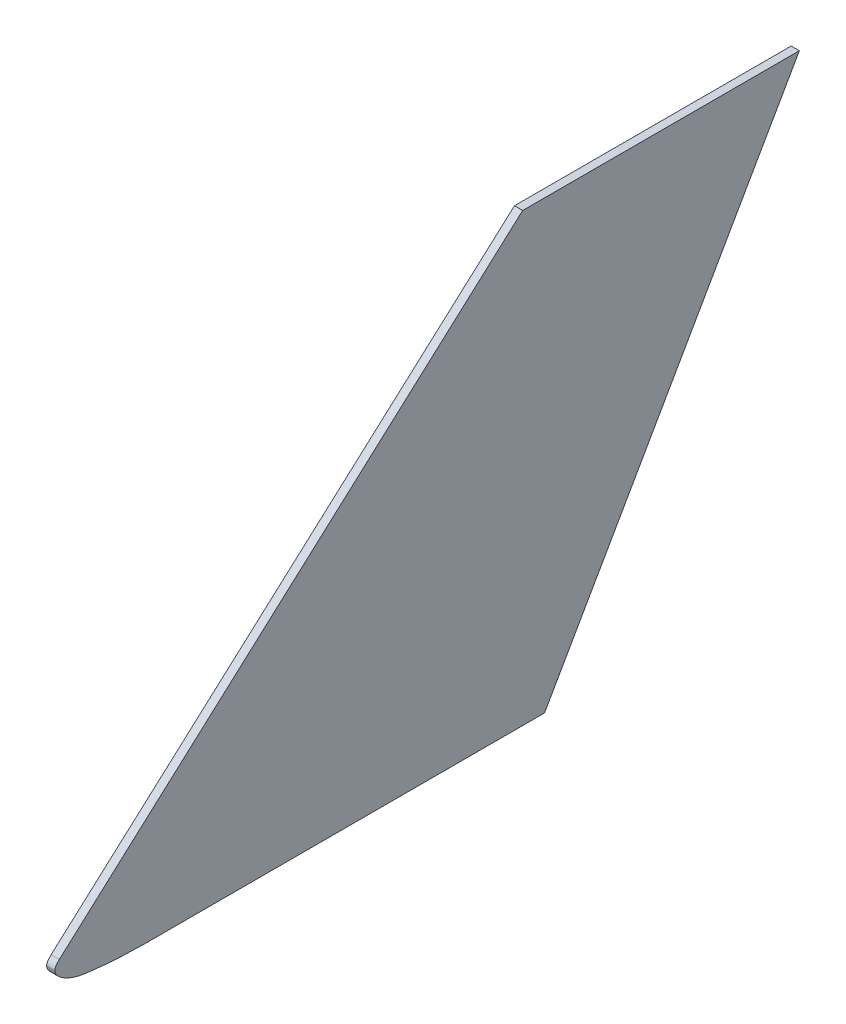
ISO-10303-21;
HEADER;
FILE_DESCRIPTION(('STEP AP214'),'2;1');
FILE_NAME('part.step','',(''),(''),'','','');
FILE_SCHEMA(('AUTOMOTIVE_DESIGN { 1 0 10303 214 1 1 1 1 }'));
ENDSEC;
DATA;
#1=APPLICATION_CONTEXT('core data for automotive mechanical design processes');
#2=APPLICATION_PROTOCOL_DEFINITION('international standard','automotive_design',2000,#1);
#3=PRODUCT_CONTEXT('',#1,'mechanical');
#4=PRODUCT('Part','Part','',(#3));
#5=PRODUCT_RELATED_PRODUCT_CATEGORY('part','',(#4));
#6=PRODUCT_DEFINITION_FORMATION('','',#4);
#7=PRODUCT_DEFINITION_CONTEXT('part definition',#1,'design');
#8=PRODUCT_DEFINITION('design','',#6,#7);
#9=PRODUCT_DEFINITION_SHAPE('','',#8);
#10=(LENGTH_UNIT() NAMED_UNIT(*) SI_UNIT(.MILLI.,.METRE.));
#11=(NAMED_UNIT(*) PLANE_ANGLE_UNIT() SI_UNIT($,.RADIAN.));
#12=(NAMED_UNIT(*) SI_UNIT($,.STERADIAN.) SOLID_ANGLE_UNIT());
#13=UNCERTAINTY_MEASURE_WITH_UNIT(LENGTH_MEASURE(1.E-05),#10,'distance_accuracy_value','');
#14=(GEOMETRIC_REPRESENTATION_CONTEXT(3) GLOBAL_UNCERTAINTY_ASSIGNED_CONTEXT((#13)) GLOBAL_UNIT_ASSIGNED_CONTEXT((#10,
#11,#12)) REPRESENTATION_CONTEXT('',''));
#15=CARTESIAN_POINT('',(0.,0.,0.));
#16=DIRECTION('',(0.,0.,1.));
#17=DIRECTION('',(1.,0.,0.));
#18=AXIS2_PLACEMENT_3D('',#15,#16,#17);
#19=CARTESIAN_POINT('',(2.667,145.,-161.163));
#20=DIRECTION('',(0.,-0.743401248874517,-0.668845709541303));
#21=DIRECTION('',(0.,0.668845709541303,-0.743401248874517));
#22=AXIS2_PLACEMENT_3D('',#19,#20,#21);
#23=PLANE('',#22);
#24=DIRECTION('',(-1.,0.,0.));
#25=VECTOR('',#24,1.);
#26=CARTESIAN_POINT('',(2.667,9.48281509372688,-10.5398546824159));
#27=LINE('',#26,#25);
#28=CARTESIAN_POINT('',(2.667,9.48281509372688,-10.5398546824159));
#29=VERTEX_POINT('',#28);
#30=CARTESIAN_POINT('',(0.,9.48281509372688,-10.5398546824159));
#31=VERTEX_POINT('',#30);
#32=EDGE_CURVE('E217',#29,#31,#27,.T.);
#33=ORIENTED_EDGE('',*,*,#32,.F.);
#34=DIRECTION('',(0.,-0.668845709541303,0.743401248874517));
#35=VECTOR('',#34,1.);
#36=CARTESIAN_POINT('',(2.667,145.,-161.163));
#37=LINE('',#36,#35);
#38=CARTESIAN_POINT('',(2.667,145.,-161.163));
#39=VERTEX_POINT('',#38);
#40=EDGE_CURVE('E116',#39,#29,#37,.T.);
#41=ORIENTED_EDGE('',*,*,#40,.F.);
#42=DIRECTION('',(-1.,0.,0.));
#43=VECTOR('',#42,1.);
#44=CARTESIAN_POINT('',(2.667,145.,-161.163));
#45=LINE('',#44,#43);
#46=CARTESIAN_POINT('',(0.,145.,-161.163));
#47=VERTEX_POINT('',#46);
#48=EDGE_CURVE('E111',#39,#47,#45,.T.);
#49=ORIENTED_EDGE('',*,*,#48,.T.);
#50=DIRECTION('',(0.,-0.668845709541303,0.743401248874517));
#51=VECTOR('',#50,1.);
#52=CARTESIAN_POINT('',(0.,145.,-161.163));
#53=LINE('',#52,#51);
#54=EDGE_CURVE('E121',#47,#31,#53,.T.);
#55=ORIENTED_EDGE('',*,*,#54,.T.);
#56=EDGE_LOOP('',(#33,#41,#49,#55));
#57=FACE_BOUND('',#56,.T.);
#58=ADVANCED_FACE('F33',(#57),#23,.F.);
#59=CARTESIAN_POINT('',(2.667,0.,0.));
#60=DIRECTION('',(0.,1.,0.));
#61=DIRECTION('',(0.,0.,1.));
#62=AXIS2_PLACEMENT_3D('',#59,#60,#61);
#63=PLANE('',#62);
#64=DIRECTION('',(-1.,0.,0.));
#65=VECTOR('',#64,1.);
#66=CARTESIAN_POINT('',(2.667,0.,-168.275));
#67=LINE('',#66,#65);
#68=CARTESIAN_POINT('',(2.667,0.,-168.275));
#69=VERTEX_POINT('',#68);
#70=CARTESIAN_POINT('',(0.,0.,-168.275));
#71=VERTEX_POINT('',#70);
#72=EDGE_CURVE('E42',#69,#71,#67,.T.);
#73=ORIENTED_EDGE('',*,*,#72,.F.);
#74=DIRECTION('',(0.,0.,-1.));
#75=VECTOR('',#74,1.);
#76=CARTESIAN_POINT('',(2.667,0.,0.));
#77=LINE('',#76,#75);
#78=CARTESIAN_POINT('',(2.667,-5.67515399336362E-12,-38.129253700367));
#79=VERTEX_POINT('',#78);
#80=EDGE_CURVE('E36',#79,#69,#77,.T.);
#81=ORIENTED_EDGE('',*,*,#80,.F.);
#82=DIRECTION('',(-1.,0.,0.));
#83=VECTOR('',#82,1.);
#84=CARTESIAN_POINT('',(2.667,-7.49834222490975E-12,-38.129253700367));
#85=LINE('',#84,#83);
#86=CARTESIAN_POINT('',(0.,-5.62376281038781E-12,-38.129253700367));
#87=VERTEX_POINT('',#86);
#88=EDGE_CURVE('E129',#87,#79,#85,.F.);
#89=ORIENTED_EDGE('',*,*,#88,.F.);
#90=DIRECTION('',(0.,0.,1.));
#91=VECTOR('',#90,1.);
#92=CARTESIAN_POINT('',(0.,0.,0.));
#93=LINE('',#92,#91);
#94=EDGE_CURVE('E128',#87,#71,#93,.F.);
#95=ORIENTED_EDGE('',*,*,#94,.T.);
#96=EDGE_LOOP('',(#73,#81,#89,#95));
#97=FACE_BOUND('',#96,.T.);
#98=ADVANCED_FACE('F277',(#97),#63,.F.);
#99=CARTESIAN_POINT('',(2.667,0.,0.));
#100=DIRECTION('',(1.,0.,0.));
#101=DIRECTION('',(0.,0.,-1.));
#102=AXIS2_PLACEMENT_3D('',#99,#100,#101);
#103=PLANE('',#102);
#104=ORIENTED_EDGE('',*,*,#40,.T.);
#105=DIRECTION('',(0.,0.,1.));
#106=VECTOR('',#105,1.);
#107=CARTESIAN_POINT('',(2.667,9.48281509372688,0.));
#108=LINE('',#107,#106);
#109=CARTESIAN_POINT('',(2.667,9.48281509372688,-10.6130492290752));
#110=VERTEX_POINT('',#109);
#111=EDGE_CURVE('E195',#110,#29,#108,.T.);
#112=ORIENTED_EDGE('',*,*,#111,.F.);
#113=CARTESIAN_POINT('',(2.667,6.96510530096529,-9.09609695231968));
#114=CARTESIAN_POINT('',(2.667,7.84201754075925,-9.05665947310691));
#115=CARTESIAN_POINT('',(2.667,8.68661145624891,-9.64995762065609));
#116=CARTESIAN_POINT('',(2.667,9.48281509372916,-10.6130492290779));
#117=B_SPLINE_CURVE_WITH_KNOTS('',3,(#113,#114,#115,#116),.UNSPECIFIED.,.F.,.F.,(4,4),
(0.0950031138030394,0.122643685896777),.UNSPECIFIED.);
#118=CARTESIAN_POINT('',(2.667,6.96510530097299,-9.09609695231932));
#119=VERTEX_POINT('',#118);
#120=EDGE_CURVE('E72',#119,#110,#117,.T.);
#121=ORIENTED_EDGE('',*,*,#120,.F.);
#122=CARTESIAN_POINT('',(2.667,1.10405974239114,-20.4791712343144));
#123=CARTESIAN_POINT('',(2.667,1.19086641299034,-19.7842066902313));
#124=CARTESIAN_POINT('',(2.667,1.69205912625934,-14.2943716879902));
#125=CARTESIAN_POINT('',(2.667,4.9600684892659,-9.18626971304355));
#126=CARTESIAN_POINT('',(2.667,6.96510530097299,-9.09609695231932));
#127=B_SPLINE_CURVE_WITH_KNOTS('',3,(#122,#123,#124,#125,#126),.UNSPECIFIED.,.F.,.F.,(4,1,4),
(0.,0.0318036714524566,0.0950031138030394),.UNSPECIFIED.);
#128=CARTESIAN_POINT('',(2.667,1.10405972617,-20.4791713656709));
#129=VERTEX_POINT('',#128);
#130=EDGE_CURVE('E177',#129,#119,#127,.T.);
#131=ORIENTED_EDGE('',*,*,#130,.F.);
#132=CARTESIAN_POINT('',(2.667,996154.645784788,-89261.3704599262));
#133=CARTESIAN_POINT('',(2.667,-997377.637337138,72339.9458838703));
#134=CARTESIAN_POINT('',(2.667,998602.130208448,-55529.9756850236));
#135=B_SPLINE_CURVE_WITH_KNOTS('',2,(#132,#133,#134),.UNSPECIFIED.,.F.,.F.,(3,3),(0.,1.),.UNSPECIFIED.);
#136=EDGE_CURVE('E197',#79,#129,#135,.T.);
#137=ORIENTED_EDGE('',*,*,#136,.F.);
#138=ORIENTED_EDGE('',*,*,#80,.T.);
#139=DIRECTION('',(0.,0.868380207092181,-0.495898997710765));
#140=VECTOR('',#139,1.);
#141=CARTESIAN_POINT('',(2.667,0.,-168.275));
#142=LINE('',#141,#140);
#143=CARTESIAN_POINT('',(2.667,145.,-251.079));
#144=VERTEX_POINT('',#143);
#145=EDGE_CURVE('E345',#69,#144,#142,.T.);
#146=ORIENTED_EDGE('',*,*,#145,.T.);
#147=DIRECTION('',(0.,0.,1.));
#148=VECTOR('',#147,1.);
#149=CARTESIAN_POINT('',(2.667,145.,-251.079));
#150=LINE('',#149,#148);
#151=EDGE_CURVE('E123',#144,#39,#150,.T.);
#152=ORIENTED_EDGE('',*,*,#151,.T.);
#153=EDGE_LOOP('',(#104,#112,#121,#131,#137,#138,#146,#152));
#154=FACE_BOUND('',#153,.T.);
#155=ADVANCED_FACE('F157',(#154),#103,.T.);
#156=CARTESIAN_POINT('',(0.,0.,0.));
#157=DIRECTION('',(1.,0.,0.));
#158=DIRECTION('',(0.,0.,-1.));
#159=AXIS2_PLACEMENT_3D('',#156,#157,#158);
#160=PLANE('',#159);
#161=DIRECTION('',(0.,0.,1.));
#162=VECTOR('',#161,1.);
#163=CARTESIAN_POINT('',(0.,9.48281509372688,0.));
#164=LINE('',#163,#162);
#165=CARTESIAN_POINT('',(0.,9.48281509372688,-10.6130492290752));
#166=VERTEX_POINT('',#165);
#167=EDGE_CURVE('E127',#166,#31,#164,.T.);
#168=ORIENTED_EDGE('',*,*,#167,.T.);
#169=ORIENTED_EDGE('',*,*,#54,.F.);
#170=DIRECTION('',(0.,0.,1.));
#171=VECTOR('',#170,1.);
#172=CARTESIAN_POINT('',(0.,145.,-251.079));
#173=LINE('',#172,#171);
#174=CARTESIAN_POINT('',(0.,145.,-251.079));
#175=VERTEX_POINT('',#174);
#176=EDGE_CURVE('E107',#175,#47,#173,.T.);
#177=ORIENTED_EDGE('',*,*,#176,.F.);
#178=DIRECTION('',(0.,0.868380207092181,-0.495898997710765));
#179=VECTOR('',#178,1.);
#180=CARTESIAN_POINT('',(0.,0.,-168.275));
#181=LINE('',#180,#179);
#182=EDGE_CURVE('E101',#71,#175,#181,.T.);
#183=ORIENTED_EDGE('',*,*,#182,.F.);
#184=ORIENTED_EDGE('',*,*,#94,.F.);
#185=CARTESIAN_POINT('',(0.,996154.645784788,-89261.3704599262));
#186=CARTESIAN_POINT('',(0.,-997377.637337138,72339.9458838703));
#187=CARTESIAN_POINT('',(0.,998602.130208448,-55529.9756850236));
#188=B_SPLINE_CURVE_WITH_KNOTS('',2,(#185,#186,#187),.UNSPECIFIED.,.F.,.F.,(3,3),(0.,1.),.UNSPECIFIED.);
#189=CARTESIAN_POINT('',(0.,1.10405972617,-20.4791713656709));
#190=VERTEX_POINT('',#189);
#191=EDGE_CURVE('E11',#190,#87,#188,.F.);
#192=ORIENTED_EDGE('',*,*,#191,.F.);
#193=CARTESIAN_POINT('',(0.,6.96510530097299,-9.09609695231932));
#194=CARTESIAN_POINT('',(0.,4.9600684892659,-9.18626971304355));
#195=CARTESIAN_POINT('',(0.,1.69205912625934,-14.2943716879902));
#196=CARTESIAN_POINT('',(0.,1.19086641299034,-19.7842066902313));
#197=CARTESIAN_POINT('',(0.,1.10405974239114,-20.4791712343144));
#198=B_SPLINE_CURVE_WITH_KNOTS('',3,(#193,#194,#195,#196,#197),.UNSPECIFIED.,.F.,.F.,(4,1,4),
(0.,0.0631994423505828,0.0950031138030394),.UNSPECIFIED.);
#199=CARTESIAN_POINT('',(0.,6.96510530097299,-9.09609695231932));
#200=VERTEX_POINT('',#199);
#201=EDGE_CURVE('E142',#190,#200,#198,.F.);
#202=ORIENTED_EDGE('',*,*,#201,.T.);
#203=CARTESIAN_POINT('',(0.,9.48281509372916,-10.6130492290779));
#204=CARTESIAN_POINT('',(0.,8.68661145624891,-9.64995762065609));
#205=CARTESIAN_POINT('',(0.,7.84201754075925,-9.05665947310691));
#206=CARTESIAN_POINT('',(0.,6.96510530096529,-9.09609695231968));
#207=B_SPLINE_CURVE_WITH_KNOTS('',3,(#203,#204,#205,#206),.UNSPECIFIED.,.F.,.F.,(4,4),
(0.0950031138030394,0.122643685896777),.UNSPECIFIED.);
#208=EDGE_CURVE('E51',#200,#166,#207,.F.);
#209=ORIENTED_EDGE('',*,*,#208,.T.);
#210=EDGE_LOOP('',(#168,#169,#177,#183,#184,#192,#202,#209));
#211=FACE_BOUND('',#210,.T.);
#212=ADVANCED_FACE('F126',(#211),#160,.F.);
#213=CARTESIAN_POINT('',(2.667,0.,-168.275));
#214=DIRECTION('',(0.,0.495898997710765,0.868380207092181));
#215=DIRECTION('',(0.,-0.868380207092181,0.495898997710765));
#216=AXIS2_PLACEMENT_3D('',#213,#214,#215);
#217=PLANE('',#216);
#218=ORIENTED_EDGE('',*,*,#182,.T.);
#219=DIRECTION('',(-1.,0.,0.));
#220=VECTOR('',#219,1.);
#221=CARTESIAN_POINT('',(2.667,145.,-251.079));
#222=LINE('',#221,#220);
#223=EDGE_CURVE('E113',#144,#175,#222,.T.);
#224=ORIENTED_EDGE('',*,*,#223,.F.);
#225=ORIENTED_EDGE('',*,*,#145,.F.);
#226=ORIENTED_EDGE('',*,*,#72,.T.);
#227=EDGE_LOOP('',(#218,#224,#225,#226));
#228=FACE_BOUND('',#227,.T.);
#229=ADVANCED_FACE('F156',(#228),#217,.F.);
#230=CARTESIAN_POINT('',(2.667,145.,-251.079));
#231=DIRECTION('',(0.,-1.,0.));
#232=DIRECTION('',(0.,0.,-1.));
#233=AXIS2_PLACEMENT_3D('',#230,#231,#232);
#234=PLANE('',#233);
#235=ORIENTED_EDGE('',*,*,#176,.T.);
#236=ORIENTED_EDGE('',*,*,#48,.F.);
#237=ORIENTED_EDGE('',*,*,#151,.F.);
#238=ORIENTED_EDGE('',*,*,#223,.T.);
#239=EDGE_LOOP('',(#235,#236,#237,#238));
#240=FACE_BOUND('',#239,.T.);
#241=ADVANCED_FACE('F109',(#240),#234,.F.);
#242=DIRECTION('',(-1.,0.,0.));
#243=VECTOR('',#242,1.);
#244=SURFACE_OF_LINEAR_EXTRUSION('',#135,#243);
#245=ORIENTED_EDGE('',*,*,#88,.T.);
#246=ORIENTED_EDGE('',*,*,#136,.T.);
#247=DIRECTION('',(-1.,0.,0.));
#248=VECTOR('',#247,1.);
#249=CARTESIAN_POINT('',(2.667,1.10405972617,-20.4791713656709));
#250=LINE('',#249,#248);
#251=EDGE_CURVE('E265',#129,#190,#250,.T.);
#252=ORIENTED_EDGE('',*,*,#251,.T.);
#253=ORIENTED_EDGE('',*,*,#191,.T.);
#254=EDGE_LOOP('',(#245,#246,#252,#253));
#255=FACE_BOUND('',#254,.T.);
#256=ADVANCED_FACE('F224',(#255),#244,.T.);
#257=CARTESIAN_POINT('',(2.667,6.96510530096529,-9.09609695231968));
#258=CARTESIAN_POINT('',(2.667,9.30603661101826,-8.99081796807329));
#259=CARTESIAN_POINT('',(2.667,15.8802560683856,-22.7078798793518));
#260=CARTESIAN_POINT('',(2.667,18.8011624659579,-41.7080559189307));
#261=CARTESIAN_POINT('',(2.667,20.1062595754783,-81.9838774274466));
#262=CARTESIAN_POINT('',(2.667,18.5816036259251,-112.063164092295));
#263=CARTESIAN_POINT('',(2.667,15.9150756349221,-131.270096952317));
#264=B_SPLINE_CURVE_WITH_KNOTS('',3,(#257,#258,#259,#260,#261,#262,#263),.UNSPECIFIED.,.F.,.F.,
(4,1,1,1,4),(0.0950031138030394,0.168790065000356,0.324836738621899,0.583849092295282,1.),.UNSPECIFIED.);
#265=DIRECTION('',(-1.,0.,0.));
#266=VECTOR('',#265,1.);
#267=SURFACE_OF_LINEAR_EXTRUSION('',#264,#266);
#268=ORIENTED_EDGE('',*,*,#208,.F.);
#269=DIRECTION('',(-1.,0.,0.));
#270=VECTOR('',#269,1.);
#271=CARTESIAN_POINT('',(2.667,6.96510530097299,-9.09609695231932));
#272=LINE('',#271,#270);
#273=EDGE_CURVE('E260',#119,#200,#272,.T.);
#274=ORIENTED_EDGE('',*,*,#273,.F.);
#275=ORIENTED_EDGE('',*,*,#120,.T.);
#276=DIRECTION('',(-1.,0.,0.));
#277=VECTOR('',#276,1.);
#278=CARTESIAN_POINT('',(2.667,9.48281509372688,-10.6130492290752));
#279=LINE('',#278,#277);
#280=EDGE_CURVE('E131',#110,#166,#279,.T.);
#281=ORIENTED_EDGE('',*,*,#280,.T.);
#282=EDGE_LOOP('',(#268,#274,#275,#281));
#283=FACE_BOUND('',#282,.T.);
#284=ADVANCED_FACE('F228',(#283),#267,.T.);
#285=CARTESIAN_POINT('',(2.667,9.48281509372688,0.));
#286=DIRECTION('',(0.,-1.,0.));
#287=DIRECTION('',(0.,0.,-1.));
#288=AXIS2_PLACEMENT_3D('',#285,#286,#287);
#289=PLANE('',#288);
#290=ORIENTED_EDGE('',*,*,#167,.F.);
#291=ORIENTED_EDGE('',*,*,#280,.F.);
#292=ORIENTED_EDGE('',*,*,#111,.T.);
#293=ORIENTED_EDGE('',*,*,#32,.T.);
#294=EDGE_LOOP('',(#290,#291,#292,#293));
#295=FACE_BOUND('',#294,.T.);
#296=ADVANCED_FACE('F229',(#295),#289,.T.);
#297=CARTESIAN_POINT('',(2.667,1.10405974239114,-20.4791712343144));
#298=CARTESIAN_POINT('',(2.667,1.19086641299034,-19.7842066902313));
#299=CARTESIAN_POINT('',(2.667,1.69205912625934,-14.2943716879902));
#300=CARTESIAN_POINT('',(2.667,4.9600684892659,-9.18626971304355));
#301=CARTESIAN_POINT('',(2.667,6.96510530097299,-9.09609695231932));
#302=B_SPLINE_CURVE_WITH_KNOTS('',3,(#297,#298,#299,#300,#301),.UNSPECIFIED.,.F.,.F.,(4,1,4),
(0.,0.0318036714524566,0.0950031138030394),.UNSPECIFIED.);
#303=DIRECTION('',(-1.,0.,0.));
#304=VECTOR('',#303,1.);
#305=SURFACE_OF_LINEAR_EXTRUSION('',#302,#304);
#306=ORIENTED_EDGE('',*,*,#201,.F.);
#307=ORIENTED_EDGE('',*,*,#251,.F.);
#308=ORIENTED_EDGE('',*,*,#130,.T.);
#309=ORIENTED_EDGE('',*,*,#273,.T.);
#310=EDGE_LOOP('',(#306,#307,#308,#309));
#311=FACE_BOUND('',#310,.T.);
#312=ADVANCED_FACE('F230',(#311),#305,.T.);
#313=CLOSED_SHELL('',(#58,#98,#155,#212,#229,#241,#256,#284,#296,#312));
#314=MANIFOLD_SOLID_BREP('B2',#313);
#315=ADVANCED_BREP_SHAPE_REPRESENTATION('',(#18,#314),#14);
#316=SHAPE_DEFINITION_REPRESENTATION(#9,#315);
ENDSEC;
END-ISO-10303-21;
